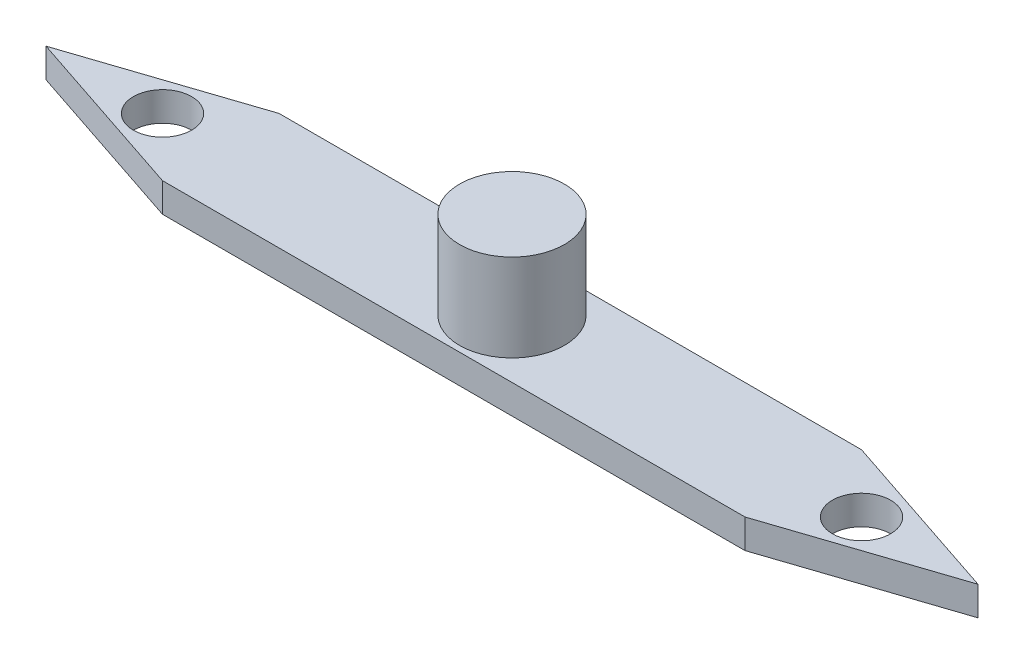
ISO-10303-21;
HEADER;
FILE_DESCRIPTION(('STEP AP214'),'2;1');
FILE_NAME('part.step','',(''),(''),'','','');
FILE_SCHEMA(('AUTOMOTIVE_DESIGN { 1 0 10303 214 1 1 1 1 }'));
ENDSEC;
DATA;
#1=APPLICATION_CONTEXT('core data for automotive mechanical design processes');
#2=APPLICATION_PROTOCOL_DEFINITION('international standard','automotive_design',2000,#1);
#3=PRODUCT_CONTEXT('',#1,'mechanical');
#4=PRODUCT('Part','Part','',(#3));
#5=PRODUCT_RELATED_PRODUCT_CATEGORY('part','',(#4));
#6=PRODUCT_DEFINITION_FORMATION('','',#4);
#7=PRODUCT_DEFINITION_CONTEXT('part definition',#1,'design');
#8=PRODUCT_DEFINITION('design','',#6,#7);
#9=PRODUCT_DEFINITION_SHAPE('','',#8);
#10=(LENGTH_UNIT() NAMED_UNIT(*) SI_UNIT(.MILLI.,.METRE.));
#11=(NAMED_UNIT(*) PLANE_ANGLE_UNIT() SI_UNIT($,.RADIAN.));
#12=(NAMED_UNIT(*) SI_UNIT($,.STERADIAN.) SOLID_ANGLE_UNIT());
#13=UNCERTAINTY_MEASURE_WITH_UNIT(LENGTH_MEASURE(1.E-05),#10,'distance_accuracy_value','');
#14=(GEOMETRIC_REPRESENTATION_CONTEXT(3) GLOBAL_UNCERTAINTY_ASSIGNED_CONTEXT((#13)) GLOBAL_UNIT_ASSIGNED_CONTEXT((#10,
#11,#12)) REPRESENTATION_CONTEXT('',''));
#15=CARTESIAN_POINT('',(0.,0.,0.));
#16=DIRECTION('',(0.,0.,1.));
#17=DIRECTION('',(1.,0.,0.));
#18=AXIS2_PLACEMENT_3D('',#15,#16,#17);
#19=CARTESIAN_POINT('',(-8.,5.,-24.));
#20=DIRECTION('',(0.316227766016838,0.,0.948683298050514));
#21=DIRECTION('',(0.948683298050514,0.,-0.316227766016838));
#22=AXIS2_PLACEMENT_3D('',#19,#20,#21);
#23=PLANE('',#22);
#24=DIRECTION('',(-0.948683298050514,0.,0.316227766016838));
#25=VECTOR('',#24,1.);
#26=CARTESIAN_POINT('',(-8.,0.,-24.));
#27=LINE('',#26,#25);
#28=CARTESIAN_POINT('',(-50.,0.,-10.));
#29=VERTEX_POINT('',#28);
#30=CARTESIAN_POINT('',(-80.,0.,0.));
#31=VERTEX_POINT('',#30);
#32=EDGE_CURVE('E122',#29,#31,#27,.T.);
#33=ORIENTED_EDGE('',*,*,#32,.T.);
#34=DIRECTION('',(0.,-1.,0.));
#35=VECTOR('',#34,1.);
#36=CARTESIAN_POINT('',(-80.,5.,0.));
#37=LINE('',#36,#35);
#38=CARTESIAN_POINT('',(-80.,5.,0.));
#39=VERTEX_POINT('',#38);
#40=EDGE_CURVE('E11',#39,#31,#37,.T.);
#41=ORIENTED_EDGE('',*,*,#40,.F.);
#42=DIRECTION('',(-0.948683298050514,0.,0.316227766016838));
#43=VECTOR('',#42,1.);
#44=CARTESIAN_POINT('',(-8.,5.,-24.));
#45=LINE('',#44,#43);
#46=CARTESIAN_POINT('',(-50.,5.,-10.));
#47=VERTEX_POINT('',#46);
#48=EDGE_CURVE('E136',#47,#39,#45,.T.);
#49=ORIENTED_EDGE('',*,*,#48,.F.);
#50=DIRECTION('',(0.,-1.,0.));
#51=VECTOR('',#50,1.);
#52=CARTESIAN_POINT('',(-50.,5.,-10.));
#53=LINE('',#52,#51);
#54=EDGE_CURVE('E54',#47,#29,#53,.T.);
#55=ORIENTED_EDGE('',*,*,#54,.T.);
#56=EDGE_LOOP('',(#33,#41,#49,#55));
#57=FACE_BOUND('',#56,.T.);
#58=ADVANCED_FACE('F36',(#57),#23,.F.);
#59=CARTESIAN_POINT('',(-7.99999999999999,5.,24.));
#60=DIRECTION('',(0.316227766016838,0.,-0.948683298050514));
#61=DIRECTION('',(-0.948683298050514,0.,-0.316227766016838));
#62=AXIS2_PLACEMENT_3D('',#59,#60,#61);
#63=PLANE('',#62);
#64=DIRECTION('',(0.948683298050514,0.,0.316227766016838));
#65=VECTOR('',#64,1.);
#66=CARTESIAN_POINT('',(-7.99999999999999,0.,24.));
#67=LINE('',#66,#65);
#68=CARTESIAN_POINT('',(-50.,0.,9.99999999999999));
#69=VERTEX_POINT('',#68);
#70=EDGE_CURVE('E124',#31,#69,#67,.T.);
#71=ORIENTED_EDGE('',*,*,#70,.T.);
#72=DIRECTION('',(0.,-1.,0.));
#73=VECTOR('',#72,1.);
#74=CARTESIAN_POINT('',(-50.,5.,9.99999999999999));
#75=LINE('',#74,#73);
#76=CARTESIAN_POINT('',(-50.,5.,9.99999999999999));
#77=VERTEX_POINT('',#76);
#78=EDGE_CURVE('E45',#77,#69,#75,.T.);
#79=ORIENTED_EDGE('',*,*,#78,.F.);
#80=DIRECTION('',(0.948683298050514,0.,0.316227766016838));
#81=VECTOR('',#80,1.);
#82=CARTESIAN_POINT('',(-7.99999999999999,5.,24.));
#83=LINE('',#82,#81);
#84=EDGE_CURVE('E86',#39,#77,#83,.T.);
#85=ORIENTED_EDGE('',*,*,#84,.F.);
#86=ORIENTED_EDGE('',*,*,#40,.T.);
#87=EDGE_LOOP('',(#71,#79,#85,#86));
#88=FACE_BOUND('',#87,.T.);
#89=ADVANCED_FACE('F162',(#88),#63,.F.);
#90=CARTESIAN_POINT('',(0.,5.,9.99999999999999));
#91=DIRECTION('',(0.,0.,-1.));
#92=DIRECTION('',(-1.,0.,0.));
#93=AXIS2_PLACEMENT_3D('',#90,#91,#92);
#94=PLANE('',#93);
#95=DIRECTION('',(1.,0.,0.));
#96=VECTOR('',#95,1.);
#97=CARTESIAN_POINT('',(0.,0.,9.99999999999999));
#98=LINE('',#97,#96);
#99=CARTESIAN_POINT('',(50.,0.,9.99999999999999));
#100=VERTEX_POINT('',#99);
#101=EDGE_CURVE('E127',#69,#100,#98,.T.);
#102=ORIENTED_EDGE('',*,*,#101,.T.);
#103=DIRECTION('',(0.,-1.,0.));
#104=VECTOR('',#103,1.);
#105=CARTESIAN_POINT('',(50.,5.,9.99999999999999));
#106=LINE('',#105,#104);
#107=CARTESIAN_POINT('',(50.,5.,9.99999999999999));
#108=VERTEX_POINT('',#107);
#109=EDGE_CURVE('E105',#108,#100,#106,.T.);
#110=ORIENTED_EDGE('',*,*,#109,.F.);
#111=DIRECTION('',(1.,0.,0.));
#112=VECTOR('',#111,1.);
#113=CARTESIAN_POINT('',(0.,5.,9.99999999999999));
#114=LINE('',#113,#112);
#115=EDGE_CURVE('E113',#77,#108,#114,.T.);
#116=ORIENTED_EDGE('',*,*,#115,.F.);
#117=ORIENTED_EDGE('',*,*,#78,.T.);
#118=EDGE_LOOP('',(#102,#110,#116,#117));
#119=FACE_BOUND('',#118,.T.);
#120=ADVANCED_FACE('F165',(#119),#94,.F.);
#121=CARTESIAN_POINT('',(8.,5.,24.));
#122=DIRECTION('',(0.316227766016838,0.,0.948683298050514));
#123=DIRECTION('',(0.948683298050514,0.,-0.316227766016838));
#124=AXIS2_PLACEMENT_3D('',#121,#122,#123);
#125=PLANE('',#124);
#126=DIRECTION('',(-0.948683298050514,0.,0.316227766016838));
#127=VECTOR('',#126,1.);
#128=CARTESIAN_POINT('',(8.,0.,24.));
#129=LINE('',#128,#127);
#130=CARTESIAN_POINT('',(80.,0.,0.));
#131=VERTEX_POINT('',#130);
#132=EDGE_CURVE('E101',#131,#100,#129,.T.);
#133=ORIENTED_EDGE('',*,*,#132,.F.);
#134=DIRECTION('',(0.,-1.,0.));
#135=VECTOR('',#134,1.);
#136=CARTESIAN_POINT('',(80.,5.,0.));
#137=LINE('',#136,#135);
#138=CARTESIAN_POINT('',(80.,5.,0.));
#139=VERTEX_POINT('',#138);
#140=EDGE_CURVE('E96',#139,#131,#137,.T.);
#141=ORIENTED_EDGE('',*,*,#140,.F.);
#142=DIRECTION('',(-0.948683298050514,0.,0.316227766016838));
#143=VECTOR('',#142,1.);
#144=CARTESIAN_POINT('',(8.,5.,24.));
#145=LINE('',#144,#143);
#146=EDGE_CURVE('E99',#139,#108,#145,.T.);
#147=ORIENTED_EDGE('',*,*,#146,.T.);
#148=ORIENTED_EDGE('',*,*,#109,.T.);
#149=EDGE_LOOP('',(#133,#141,#147,#148));
#150=FACE_BOUND('',#149,.T.);
#151=ADVANCED_FACE('F98',(#150),#125,.T.);
#152=CARTESIAN_POINT('',(8.00000000000001,5.,-24.));
#153=DIRECTION('',(0.316227766016838,0.,-0.948683298050514));
#154=DIRECTION('',(-0.948683298050514,0.,-0.316227766016838));
#155=AXIS2_PLACEMENT_3D('',#152,#153,#154);
#156=PLANE('',#155);
#157=DIRECTION('',(0.948683298050514,0.,0.316227766016838));
#158=VECTOR('',#157,1.);
#159=CARTESIAN_POINT('',(8.00000000000001,0.,-24.));
#160=LINE('',#159,#158);
#161=CARTESIAN_POINT('',(50.,0.,-10.));
#162=VERTEX_POINT('',#161);
#163=EDGE_CURVE('E131',#162,#131,#160,.T.);
#164=ORIENTED_EDGE('',*,*,#163,.F.);
#165=DIRECTION('',(0.,-1.,0.));
#166=VECTOR('',#165,1.);
#167=CARTESIAN_POINT('',(50.,5.,-10.));
#168=LINE('',#167,#166);
#169=CARTESIAN_POINT('',(50.,5.,-10.));
#170=VERTEX_POINT('',#169);
#171=EDGE_CURVE('E74',#170,#162,#168,.T.);
#172=ORIENTED_EDGE('',*,*,#171,.F.);
#173=DIRECTION('',(0.948683298050514,0.,0.316227766016838));
#174=VECTOR('',#173,1.);
#175=CARTESIAN_POINT('',(8.00000000000001,5.,-24.));
#176=LINE('',#175,#174);
#177=EDGE_CURVE('E111',#170,#139,#176,.T.);
#178=ORIENTED_EDGE('',*,*,#177,.T.);
#179=ORIENTED_EDGE('',*,*,#140,.T.);
#180=EDGE_LOOP('',(#164,#172,#178,#179));
#181=FACE_BOUND('',#180,.T.);
#182=ADVANCED_FACE('F116',(#181),#156,.T.);
#183=CARTESIAN_POINT('',(0.,5.,-10.));
#184=DIRECTION('',(0.,0.,-1.));
#185=DIRECTION('',(-1.,0.,0.));
#186=AXIS2_PLACEMENT_3D('',#183,#184,#185);
#187=PLANE('',#186);
#188=DIRECTION('',(1.,0.,0.));
#189=VECTOR('',#188,1.);
#190=CARTESIAN_POINT('',(0.,0.,-10.));
#191=LINE('',#190,#189);
#192=EDGE_CURVE('E133',#29,#162,#191,.T.);
#193=ORIENTED_EDGE('',*,*,#192,.F.);
#194=ORIENTED_EDGE('',*,*,#54,.F.);
#195=DIRECTION('',(1.,0.,0.));
#196=VECTOR('',#195,1.);
#197=CARTESIAN_POINT('',(0.,5.,-10.));
#198=LINE('',#197,#196);
#199=EDGE_CURVE('E117',#47,#170,#198,.T.);
#200=ORIENTED_EDGE('',*,*,#199,.T.);
#201=ORIENTED_EDGE('',*,*,#171,.T.);
#202=EDGE_LOOP('',(#193,#194,#200,#201));
#203=FACE_BOUND('',#202,.T.);
#204=ADVANCED_FACE('F168',(#203),#187,.T.);
#205=CARTESIAN_POINT('',(0.,5.,0.));
#206=DIRECTION('',(0.,1.,0.));
#207=DIRECTION('',(0.,0.,1.));
#208=AXIS2_PLACEMENT_3D('',#205,#206,#207);
#209=PLANE('',#208);
#210=CARTESIAN_POINT('',(60.,5.,0.));
#211=DIRECTION('',(0.,1.,0.));
#212=DIRECTION('',(0.,0.,1.));
#213=AXIS2_PLACEMENT_3D('',#210,#211,#212);
#214=CIRCLE('',#213,5.);
#215=CARTESIAN_POINT('',(60.,5.,5.));
#216=VERTEX_POINT('',#215);
#217=EDGE_CURVE('E143',#216,#216,#214,.T.);
#218=ORIENTED_EDGE('',*,*,#217,.F.);
#219=EDGE_LOOP('',(#218));
#220=FACE_BOUND('',#219,.T.);
#221=CARTESIAN_POINT('',(-60.,5.,0.));
#222=DIRECTION('',(0.,1.,0.));
#223=DIRECTION('',(0.,0.,1.));
#224=AXIS2_PLACEMENT_3D('',#221,#222,#223);
#225=CIRCLE('',#224,5.);
#226=CARTESIAN_POINT('',(-60.,5.,5.));
#227=VERTEX_POINT('',#226);
#228=EDGE_CURVE('E149',#227,#227,#225,.T.);
#229=ORIENTED_EDGE('',*,*,#228,.F.);
#230=EDGE_LOOP('',(#229));
#231=FACE_BOUND('',#230,.T.);
#232=CARTESIAN_POINT('',(0.,5.,0.));
#233=DIRECTION('',(0.,1.,0.));
#234=DIRECTION('',(0.,0.,1.));
#235=AXIS2_PLACEMENT_3D('',#232,#233,#234);
#236=CIRCLE('',#235,9.);
#237=CARTESIAN_POINT('',(0.,5.,9.));
#238=VERTEX_POINT('',#237);
#239=EDGE_CURVE('E147',#238,#238,#236,.T.);
#240=ORIENTED_EDGE('',*,*,#239,.F.);
#241=EDGE_LOOP('',(#240));
#242=FACE_BOUND('',#241,.T.);
#243=ORIENTED_EDGE('',*,*,#48,.T.);
#244=ORIENTED_EDGE('',*,*,#84,.T.);
#245=ORIENTED_EDGE('',*,*,#115,.T.);
#246=ORIENTED_EDGE('',*,*,#146,.F.);
#247=ORIENTED_EDGE('',*,*,#177,.F.);
#248=ORIENTED_EDGE('',*,*,#199,.F.);
#249=EDGE_LOOP('',(#243,#244,#245,#246,#247,#248));
#250=FACE_BOUND('',#249,.T.);
#251=ADVANCED_FACE('F109',(#220,#231,#242,#250),#209,.T.);
#252=CARTESIAN_POINT('',(0.,0.,0.));
#253=DIRECTION('',(0.,1.,0.));
#254=DIRECTION('',(0.,0.,1.));
#255=AXIS2_PLACEMENT_3D('',#252,#253,#254);
#256=PLANE('',#255);
#257=CARTESIAN_POINT('',(60.,0.,0.));
#258=DIRECTION('',(0.,1.,0.));
#259=DIRECTION('',(0.,0.,1.));
#260=AXIS2_PLACEMENT_3D('',#257,#258,#259);
#261=CIRCLE('',#260,5.);
#262=CARTESIAN_POINT('',(60.,0.,5.));
#263=VERTEX_POINT('',#262);
#264=EDGE_CURVE('E39',#263,#263,#261,.T.);
#265=ORIENTED_EDGE('',*,*,#264,.T.);
#266=EDGE_LOOP('',(#265));
#267=FACE_BOUND('',#266,.T.);
#268=CARTESIAN_POINT('',(-60.,0.,0.));
#269=DIRECTION('',(0.,1.,0.));
#270=DIRECTION('',(0.,0.,1.));
#271=AXIS2_PLACEMENT_3D('',#268,#269,#270);
#272=CIRCLE('',#271,5.);
#273=CARTESIAN_POINT('',(-60.,0.,5.));
#274=VERTEX_POINT('',#273);
#275=EDGE_CURVE('E141',#274,#274,#272,.T.);
#276=ORIENTED_EDGE('',*,*,#275,.T.);
#277=EDGE_LOOP('',(#276));
#278=FACE_BOUND('',#277,.T.);
#279=ORIENTED_EDGE('',*,*,#32,.F.);
#280=ORIENTED_EDGE('',*,*,#192,.T.);
#281=ORIENTED_EDGE('',*,*,#163,.T.);
#282=ORIENTED_EDGE('',*,*,#132,.T.);
#283=ORIENTED_EDGE('',*,*,#101,.F.);
#284=ORIENTED_EDGE('',*,*,#70,.F.);
#285=EDGE_LOOP('',(#279,#280,#281,#282,#283,#284));
#286=FACE_BOUND('',#285,.T.);
#287=ADVANCED_FACE('F167',(#267,#278,#286),#256,.F.);
#288=CARTESIAN_POINT('',(0.,20.,0.));
#289=DIRECTION('',(0.,-1.,0.));
#290=DIRECTION('',(0.,0.,-1.));
#291=AXIS2_PLACEMENT_3D('',#288,#289,#290);
#292=CYLINDRICAL_SURFACE('',#291,9.);
#293=CARTESIAN_POINT('',(0.,20.,0.));
#294=DIRECTION('',(0.,1.,0.));
#295=DIRECTION('',(0.,0.,1.));
#296=AXIS2_PLACEMENT_3D('',#293,#294,#295);
#297=CIRCLE('',#296,9.);
#298=CARTESIAN_POINT('',(0.,20.,9.));
#299=VERTEX_POINT('',#298);
#300=EDGE_CURVE('E125',#299,#299,#297,.T.);
#301=ORIENTED_EDGE('',*,*,#300,.F.);
#302=EDGE_LOOP('',(#301));
#303=FACE_BOUND('',#302,.T.);
#304=ORIENTED_EDGE('',*,*,#239,.T.);
#305=EDGE_LOOP('',(#304));
#306=FACE_BOUND('',#305,.T.);
#307=ADVANCED_FACE('F207',(#303,#306),#292,.T.);
#308=CARTESIAN_POINT('',(0.,20.,0.));
#309=DIRECTION('',(0.,1.,0.));
#310=DIRECTION('',(0.,0.,1.));
#311=AXIS2_PLACEMENT_3D('',#308,#309,#310);
#312=PLANE('',#311);
#313=ORIENTED_EDGE('',*,*,#300,.T.);
#314=EDGE_LOOP('',(#313));
#315=FACE_BOUND('',#314,.T.);
#316=ADVANCED_FACE('F212',(#315),#312,.T.);
#317=CARTESIAN_POINT('',(-60.,-10.,0.));
#318=DIRECTION('',(0.,1.,0.));
#319=DIRECTION('',(0.,0.,1.));
#320=AXIS2_PLACEMENT_3D('',#317,#318,#319);
#321=CYLINDRICAL_SURFACE('',#320,5.);
#322=ORIENTED_EDGE('',*,*,#228,.T.);
#323=EDGE_LOOP('',(#322));
#324=FACE_BOUND('',#323,.T.);
#325=ORIENTED_EDGE('',*,*,#275,.F.);
#326=EDGE_LOOP('',(#325));
#327=FACE_BOUND('',#326,.T.);
#328=ADVANCED_FACE('F224',(#324,#327),#321,.F.);
#329=CARTESIAN_POINT('',(60.,-10.,0.));
#330=DIRECTION('',(0.,1.,0.));
#331=DIRECTION('',(0.,0.,1.));
#332=AXIS2_PLACEMENT_3D('',#329,#330,#331);
#333=CYLINDRICAL_SURFACE('',#332,5.);
#334=ORIENTED_EDGE('',*,*,#217,.T.);
#335=EDGE_LOOP('',(#334));
#336=FACE_BOUND('',#335,.T.);
#337=ORIENTED_EDGE('',*,*,#264,.F.);
#338=EDGE_LOOP('',(#337));
#339=FACE_BOUND('',#338,.T.);
#340=ADVANCED_FACE('F249',(#336,#339),#333,.F.);
#341=CLOSED_SHELL('',(#58,#89,#120,#151,#182,#204,#251,#287,#307,#316,#328,#340));
#342=MANIFOLD_SOLID_BREP('B2',#341);
#343=ADVANCED_BREP_SHAPE_REPRESENTATION('',(#18,#342),#14);
#344=SHAPE_DEFINITION_REPRESENTATION(#9,#343);
ENDSEC;
END-ISO-10303-21;
